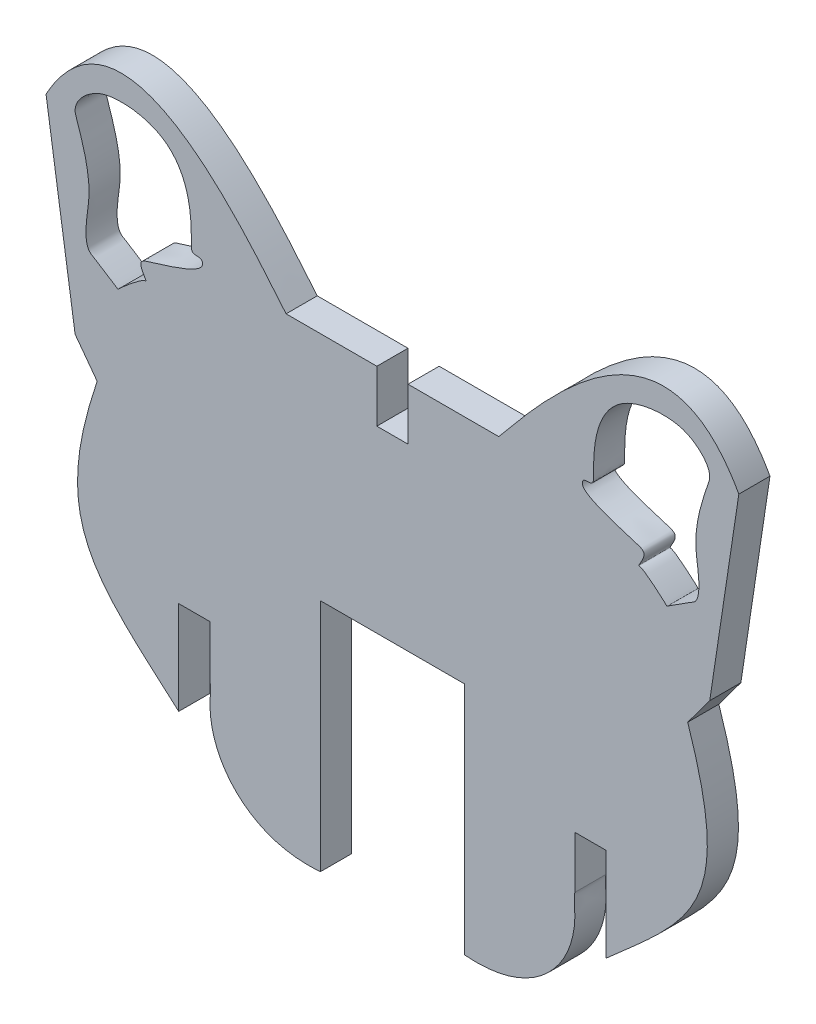
ISO-10303-21;
HEADER;
FILE_DESCRIPTION(('STEP AP214'),'2;1');
FILE_NAME('part.step','',(''),(''),'','','');
FILE_SCHEMA(('AUTOMOTIVE_DESIGN { 1 0 10303 214 1 1 1 1 }'));
ENDSEC;
DATA;
#1=APPLICATION_CONTEXT('core data for automotive mechanical design processes');
#2=APPLICATION_PROTOCOL_DEFINITION('international standard','automotive_design',2000,#1);
#3=PRODUCT_CONTEXT('',#1,'mechanical');
#4=PRODUCT('Part','Part','',(#3));
#5=PRODUCT_RELATED_PRODUCT_CATEGORY('part','',(#4));
#6=PRODUCT_DEFINITION_FORMATION('','',#4);
#7=PRODUCT_DEFINITION_CONTEXT('part definition',#1,'design');
#8=PRODUCT_DEFINITION('design','',#6,#7);
#9=PRODUCT_DEFINITION_SHAPE('','',#8);
#10=(LENGTH_UNIT() NAMED_UNIT(*) SI_UNIT(.MILLI.,.METRE.));
#11=(NAMED_UNIT(*) PLANE_ANGLE_UNIT() SI_UNIT($,.RADIAN.));
#12=(NAMED_UNIT(*) SI_UNIT($,.STERADIAN.) SOLID_ANGLE_UNIT());
#13=UNCERTAINTY_MEASURE_WITH_UNIT(LENGTH_MEASURE(1.E-05),#10,'distance_accuracy_value','');
#14=(GEOMETRIC_REPRESENTATION_CONTEXT(3) GLOBAL_UNCERTAINTY_ASSIGNED_CONTEXT((#13)) GLOBAL_UNIT_ASSIGNED_CONTEXT((#10,
#11,#12)) REPRESENTATION_CONTEXT('',''));
#15=CARTESIAN_POINT('',(0.,0.,0.));
#16=DIRECTION('',(0.,0.,1.));
#17=DIRECTION('',(1.,0.,0.));
#18=AXIS2_PLACEMENT_3D('',#15,#16,#17);
#19=CARTESIAN_POINT('',(10.2407732834807,22.2758124596455,3.));
#20=CARTESIAN_POINT('',(15.1352838805121,28.2082067401011,3.));
#21=CARTESIAN_POINT('',(26.2070604411327,42.0098659417211,3.));
#22=CARTESIAN_POINT('',(33.3623556721946,29.0385877180808,3.));
#23=B_SPLINE_CURVE_WITH_KNOTS('',3,(#19,#20,#21,#22),.UNSPECIFIED.,.F.,.F.,(4,4),(0.,1.),.UNSPECIFIED.);
#24=DIRECTION('',(0.,0.,-1.));
#25=VECTOR('',#24,1.);
#26=SURFACE_OF_LINEAR_EXTRUSION('',#23,#25);
#27=CARTESIAN_POINT('',(10.2407732834807,22.2758124596455,0.));
#28=CARTESIAN_POINT('',(15.1352838805121,28.2082067401011,0.));
#29=CARTESIAN_POINT('',(26.2070604411327,42.0098659417211,0.));
#30=CARTESIAN_POINT('',(33.3623556721946,29.0385877180808,0.));
#31=B_SPLINE_CURVE_WITH_KNOTS('',3,(#27,#28,#29,#30),.UNSPECIFIED.,.F.,.F.,(4,4),(0.,1.),.UNSPECIFIED.);
#32=CARTESIAN_POINT('',(10.2407732834807,22.2758124596455,0.));
#33=VERTEX_POINT('',#32);
#34=CARTESIAN_POINT('',(33.3623556721946,29.0385877180808,0.));
#35=VERTEX_POINT('',#34);
#36=EDGE_CURVE('E360',#33,#35,#31,.T.);
#37=ORIENTED_EDGE('',*,*,#36,.F.);
#38=DIRECTION('',(0.,0.,-1.));
#39=VECTOR('',#38,1.);
#40=CARTESIAN_POINT('',(10.2407732834807,22.2758124596455,3.));
#41=LINE('',#40,#39);
#42=CARTESIAN_POINT('',(10.2407732834807,22.2758124596455,3.));
#43=VERTEX_POINT('',#42);
#44=EDGE_CURVE('E11',#43,#33,#41,.T.);
#45=ORIENTED_EDGE('',*,*,#44,.F.);
#46=CARTESIAN_POINT('',(33.3623556721946,29.0385877180808,3.));
#47=VERTEX_POINT('',#46);
#48=EDGE_CURVE('E460',#43,#47,#23,.T.);
#49=ORIENTED_EDGE('',*,*,#48,.T.);
#50=DIRECTION('',(0.,0.,-1.));
#51=VECTOR('',#50,1.);
#52=CARTESIAN_POINT('',(33.3623556721946,29.0385877180808,3.));
#53=LINE('',#52,#51);
#54=EDGE_CURVE('E53',#47,#35,#53,.T.);
#55=ORIENTED_EDGE('',*,*,#54,.T.);
#56=EDGE_LOOP('',(#37,#45,#49,#55));
#57=FACE_BOUND('',#56,.T.);
#58=ADVANCED_FACE('F35',(#57),#26,.T.);
#59=CARTESIAN_POINT('',(0.,22.2758124596455,3.));
#60=DIRECTION('',(0.,1.,0.));
#61=DIRECTION('',(0.,0.,1.));
#62=AXIS2_PLACEMENT_3D('',#59,#60,#61);
#63=PLANE('',#62);
#64=DIRECTION('',(1.,0.,0.));
#65=VECTOR('',#64,1.);
#66=CARTESIAN_POINT('',(0.,22.2758124596455,0.));
#67=LINE('',#66,#65);
#68=CARTESIAN_POINT('',(1.5,22.2758124596455,0.));
#69=VERTEX_POINT('',#68);
#70=EDGE_CURVE('E357',#69,#33,#67,.T.);
#71=ORIENTED_EDGE('',*,*,#70,.F.);
#72=DIRECTION('',(0.,0.,-1.));
#73=VECTOR('',#72,1.);
#74=CARTESIAN_POINT('',(1.5,22.2758124596455,3.));
#75=LINE('',#74,#73);
#76=CARTESIAN_POINT('',(1.5,22.2758124596455,3.));
#77=VERTEX_POINT('',#76);
#78=EDGE_CURVE('E45',#77,#69,#75,.T.);
#79=ORIENTED_EDGE('',*,*,#78,.F.);
#80=DIRECTION('',(1.,0.,0.));
#81=VECTOR('',#80,1.);
#82=CARTESIAN_POINT('',(0.,22.2758124596455,3.));
#83=LINE('',#82,#81);
#84=EDGE_CURVE('E463',#77,#43,#83,.T.);
#85=ORIENTED_EDGE('',*,*,#84,.T.);
#86=ORIENTED_EDGE('',*,*,#44,.T.);
#87=EDGE_LOOP('',(#71,#79,#85,#86));
#88=FACE_BOUND('',#87,.T.);
#89=ADVANCED_FACE('F358',(#88),#63,.T.);
#90=CARTESIAN_POINT('',(1.5,0.,3.));
#91=DIRECTION('',(-1.,0.,0.));
#92=DIRECTION('',(0.,0.,1.));
#93=AXIS2_PLACEMENT_3D('',#90,#91,#92);
#94=PLANE('',#93);
#95=DIRECTION('',(0.,1.,0.));
#96=VECTOR('',#95,1.);
#97=CARTESIAN_POINT('',(1.5,0.,0.));
#98=LINE('',#97,#96);
#99=CARTESIAN_POINT('',(1.5,17.2758124596455,0.));
#100=VERTEX_POINT('',#99);
#101=EDGE_CURVE('E350',#100,#69,#98,.T.);
#102=ORIENTED_EDGE('',*,*,#101,.F.);
#103=DIRECTION('',(0.,0.,-1.));
#104=VECTOR('',#103,1.);
#105=CARTESIAN_POINT('',(1.5,17.2758124596455,3.));
#106=LINE('',#105,#104);
#107=CARTESIAN_POINT('',(1.5,17.2758124596455,3.));
#108=VERTEX_POINT('',#107);
#109=EDGE_CURVE('E343',#108,#100,#106,.T.);
#110=ORIENTED_EDGE('',*,*,#109,.F.);
#111=DIRECTION('',(0.,1.,0.));
#112=VECTOR('',#111,1.);
#113=CARTESIAN_POINT('',(1.5,0.,3.));
#114=LINE('',#113,#112);
#115=EDGE_CURVE('E352',#108,#77,#114,.T.);
#116=ORIENTED_EDGE('',*,*,#115,.T.);
#117=ORIENTED_EDGE('',*,*,#78,.T.);
#118=EDGE_LOOP('',(#102,#110,#116,#117));
#119=FACE_BOUND('',#118,.T.);
#120=ADVANCED_FACE('F348',(#119),#94,.T.);
#121=CARTESIAN_POINT('',(0.,17.2758124596455,3.));
#122=DIRECTION('',(0.,-1.,0.));
#123=DIRECTION('',(0.,0.,-1.));
#124=AXIS2_PLACEMENT_3D('',#121,#122,#123);
#125=PLANE('',#124);
#126=DIRECTION('',(-1.,0.,0.));
#127=VECTOR('',#126,1.);
#128=CARTESIAN_POINT('',(0.,17.2758124596455,0.));
#129=LINE('',#128,#127);
#130=CARTESIAN_POINT('',(-1.5,17.2758124596455,0.));
#131=VERTEX_POINT('',#130);
#132=EDGE_CURVE('E365',#100,#131,#129,.T.);
#133=ORIENTED_EDGE('',*,*,#132,.T.);
#134=DIRECTION('',(0.,0.,-1.));
#135=VECTOR('',#134,1.);
#136=CARTESIAN_POINT('',(-1.5,17.2758124596455,3.));
#137=LINE('',#136,#135);
#138=CARTESIAN_POINT('',(-1.5,17.2758124596455,3.));
#139=VERTEX_POINT('',#138);
#140=EDGE_CURVE('E340',#139,#131,#137,.T.);
#141=ORIENTED_EDGE('',*,*,#140,.F.);
#142=DIRECTION('',(-1.,0.,0.));
#143=VECTOR('',#142,1.);
#144=CARTESIAN_POINT('',(0.,17.2758124596455,3.));
#145=LINE('',#144,#143);
#146=EDGE_CURVE('E559',#108,#139,#145,.T.);
#147=ORIENTED_EDGE('',*,*,#146,.F.);
#148=ORIENTED_EDGE('',*,*,#109,.T.);
#149=EDGE_LOOP('',(#133,#141,#147,#148));
#150=FACE_BOUND('',#149,.T.);
#151=ADVANCED_FACE('F485',(#150),#125,.F.);
#152=CARTESIAN_POINT('',(-1.5,0.,3.));
#153=DIRECTION('',(-1.,0.,0.));
#154=DIRECTION('',(0.,0.,1.));
#155=AXIS2_PLACEMENT_3D('',#152,#153,#154);
#156=PLANE('',#155);
#157=DIRECTION('',(0.,1.,0.));
#158=VECTOR('',#157,1.);
#159=CARTESIAN_POINT('',(-1.5,0.,0.));
#160=LINE('',#159,#158);
#161=CARTESIAN_POINT('',(-1.5,22.2758124596455,0.));
#162=VERTEX_POINT('',#161);
#163=EDGE_CURVE('E367',#131,#162,#160,.T.);
#164=ORIENTED_EDGE('',*,*,#163,.T.);
#165=DIRECTION('',(0.,0.,-1.));
#166=VECTOR('',#165,1.);
#167=CARTESIAN_POINT('',(-1.5,22.2758124596455,3.));
#168=LINE('',#167,#166);
#169=CARTESIAN_POINT('',(-1.5,22.2758124596455,3.));
#170=VERTEX_POINT('',#169);
#171=EDGE_CURVE('E337',#170,#162,#168,.T.);
#172=ORIENTED_EDGE('',*,*,#171,.F.);
#173=DIRECTION('',(0.,1.,0.));
#174=VECTOR('',#173,1.);
#175=CARTESIAN_POINT('',(-1.5,0.,3.));
#176=LINE('',#175,#174);
#177=EDGE_CURVE('E556',#139,#170,#176,.T.);
#178=ORIENTED_EDGE('',*,*,#177,.F.);
#179=ORIENTED_EDGE('',*,*,#140,.T.);
#180=EDGE_LOOP('',(#164,#172,#178,#179));
#181=FACE_BOUND('',#180,.T.);
#182=ADVANCED_FACE('F488',(#181),#156,.F.);
#183=CARTESIAN_POINT('',(0.,22.2758124596455,3.));
#184=DIRECTION('',(0.,-1.,0.));
#185=DIRECTION('',(0.,0.,-1.));
#186=AXIS2_PLACEMENT_3D('',#183,#184,#185);
#187=PLANE('',#186);
#188=DIRECTION('',(-1.,0.,0.));
#189=VECTOR('',#188,1.);
#190=CARTESIAN_POINT('',(0.,22.2758124596455,0.));
#191=LINE('',#190,#189);
#192=CARTESIAN_POINT('',(-10.2407732834807,22.2758124596455,0.));
#193=VERTEX_POINT('',#192);
#194=EDGE_CURVE('E372',#162,#193,#191,.T.);
#195=ORIENTED_EDGE('',*,*,#194,.T.);
#196=DIRECTION('',(0.,0.,-1.));
#197=VECTOR('',#196,1.);
#198=CARTESIAN_POINT('',(-10.2407732834807,22.2758124596455,3.));
#199=LINE('',#198,#197);
#200=CARTESIAN_POINT('',(-10.2407732834807,22.2758124596455,3.));
#201=VERTEX_POINT('',#200);
#202=EDGE_CURVE('E334',#201,#193,#199,.T.);
#203=ORIENTED_EDGE('',*,*,#202,.F.);
#204=DIRECTION('',(-1.,0.,0.));
#205=VECTOR('',#204,1.);
#206=CARTESIAN_POINT('',(0.,22.2758124596455,3.));
#207=LINE('',#206,#205);
#208=EDGE_CURVE('E512',#170,#201,#207,.T.);
#209=ORIENTED_EDGE('',*,*,#208,.F.);
#210=ORIENTED_EDGE('',*,*,#171,.T.);
#211=EDGE_LOOP('',(#195,#203,#209,#210));
#212=FACE_BOUND('',#211,.T.);
#213=ADVANCED_FACE('F492',(#212),#187,.F.);
#214=CARTESIAN_POINT('',(-10.2407732834807,22.2758124596455,3.));
#215=CARTESIAN_POINT('',(-15.1352838805121,28.2082067401011,3.));
#216=CARTESIAN_POINT('',(-26.2070604411327,42.0098659417211,3.));
#217=CARTESIAN_POINT('',(-33.3623556721946,29.0385877180808,3.));
#218=B_SPLINE_CURVE_WITH_KNOTS('',3,(#214,#215,#216,#217),.UNSPECIFIED.,.F.,.F.,(4,4),(0.,1.),.UNSPECIFIED.);
#219=DIRECTION('',(0.,0.,-1.));
#220=VECTOR('',#219,1.);
#221=SURFACE_OF_LINEAR_EXTRUSION('',#218,#220);
#222=CARTESIAN_POINT('',(-10.2407732834807,22.2758124596455,0.));
#223=CARTESIAN_POINT('',(-15.1352838805121,28.2082067401011,0.));
#224=CARTESIAN_POINT('',(-26.2070604411327,42.0098659417211,0.));
#225=CARTESIAN_POINT('',(-33.3623556721946,29.0385877180808,0.));
#226=B_SPLINE_CURVE_WITH_KNOTS('',3,(#222,#223,#224,#225),.UNSPECIFIED.,.F.,.F.,(4,4),(0.,1.),.UNSPECIFIED.);
#227=CARTESIAN_POINT('',(-33.3623556721946,29.0385877180808,0.));
#228=VERTEX_POINT('',#227);
#229=EDGE_CURVE('E375',#193,#228,#226,.T.);
#230=ORIENTED_EDGE('',*,*,#229,.T.);
#231=DIRECTION('',(0.,0.,-1.));
#232=VECTOR('',#231,1.);
#233=CARTESIAN_POINT('',(-33.3623556721946,29.0385877180808,3.));
#234=LINE('',#233,#232);
#235=CARTESIAN_POINT('',(-33.3623556721946,29.0385877180808,3.));
#236=VERTEX_POINT('',#235);
#237=EDGE_CURVE('E331',#236,#228,#234,.T.);
#238=ORIENTED_EDGE('',*,*,#237,.F.);
#239=EDGE_CURVE('E504',#201,#236,#218,.T.);
#240=ORIENTED_EDGE('',*,*,#239,.F.);
#241=ORIENTED_EDGE('',*,*,#202,.T.);
#242=EDGE_LOOP('',(#230,#238,#240,#241));
#243=FACE_BOUND('',#242,.T.);
#244=ADVANCED_FACE('F496',(#243),#221,.F.);
#245=CARTESIAN_POINT('',(-28.3546378058958,-4.26372827527502,3.));
#246=DIRECTION('',(0.988882400585958,0.148699690017676,0.));
#247=DIRECTION('',(-0.148699690017676,0.988882400585958,0.));
#248=AXIS2_PLACEMENT_3D('',#245,#246,#247);
#249=PLANE('',#248);
#250=DIRECTION('',(0.148699690017676,-0.988882400585958,0.));
#251=VECTOR('',#250,1.);
#252=CARTESIAN_POINT('',(-28.3546378058958,-4.26372827527502,0.));
#253=LINE('',#252,#251);
#254=CARTESIAN_POINT('',(-30.5611824366832,10.4102307036154,0.));
#255=VERTEX_POINT('',#254);
#256=EDGE_CURVE('E380',#228,#255,#253,.T.);
#257=ORIENTED_EDGE('',*,*,#256,.T.);
#258=DIRECTION('',(0.,0.,-1.));
#259=VECTOR('',#258,1.);
#260=CARTESIAN_POINT('',(-30.5611824366832,10.4102307036154,3.));
#261=LINE('',#260,#259);
#262=CARTESIAN_POINT('',(-30.5611824366832,10.4102307036154,3.));
#263=VERTEX_POINT('',#262);
#264=EDGE_CURVE('E328',#263,#255,#261,.T.);
#265=ORIENTED_EDGE('',*,*,#264,.F.);
#266=DIRECTION('',(0.148699690017676,-0.988882400585958,0.));
#267=VECTOR('',#266,1.);
#268=CARTESIAN_POINT('',(-28.3546378058958,-4.26372827527502,3.));
#269=LINE('',#268,#267);
#270=EDGE_CURVE('E511',#236,#263,#269,.T.);
#271=ORIENTED_EDGE('',*,*,#270,.F.);
#272=ORIENTED_EDGE('',*,*,#237,.T.);
#273=EDGE_LOOP('',(#257,#265,#271,#272));
#274=FACE_BOUND('',#273,.T.);
#275=ADVANCED_FACE('F501',(#274),#249,.F.);
#276=CARTESIAN_POINT('',(-14.7102254311662,-10.9275960345806,3.));
#277=DIRECTION('',(0.802743847954452,0.596324001337594,0.));
#278=DIRECTION('',(-0.596324001337595,0.802743847954452,0.));
#279=AXIS2_PLACEMENT_3D('',#276,#277,#278);
#280=PLANE('',#279);
#281=DIRECTION('',(0.596324001337595,-0.802743847954452,0.));
#282=VECTOR('',#281,1.);
#283=CARTESIAN_POINT('',(-14.7102254311662,-10.9275960345806,0.));
#284=LINE('',#283,#282);
#285=CARTESIAN_POINT('',(-28.4383445395592,7.55256430364083,0.));
#286=VERTEX_POINT('',#285);
#287=EDGE_CURVE('E386',#255,#286,#284,.T.);
#288=ORIENTED_EDGE('',*,*,#287,.T.);
#289=DIRECTION('',(0.,0.,-1.));
#290=VECTOR('',#289,1.);
#291=CARTESIAN_POINT('',(-28.4383445395592,7.55256430364083,3.));
#292=LINE('',#291,#290);
#293=CARTESIAN_POINT('',(-28.4383445395592,7.55256430364083,3.));
#294=VERTEX_POINT('',#293);
#295=EDGE_CURVE('E325',#294,#286,#292,.T.);
#296=ORIENTED_EDGE('',*,*,#295,.F.);
#297=DIRECTION('',(0.596324001337595,-0.802743847954452,0.));
#298=VECTOR('',#297,1.);
#299=CARTESIAN_POINT('',(-14.7102254311662,-10.9275960345806,3.));
#300=LINE('',#299,#298);
#301=EDGE_CURVE('E519',#263,#294,#300,.T.);
#302=ORIENTED_EDGE('',*,*,#301,.F.);
#303=ORIENTED_EDGE('',*,*,#264,.T.);
#304=EDGE_LOOP('',(#288,#296,#302,#303));
#305=FACE_BOUND('',#304,.T.);
#306=ADVANCED_FACE('F538',(#305),#280,.F.);
#307=CARTESIAN_POINT('',(-28.4383445395592,7.55256430364083,3.));
#308=CARTESIAN_POINT('',(-32.9976327768061,-6.01858174026014,3.));
#309=CARTESIAN_POINT('',(-28.8808972115854,-8.73666562107748,3.));
#310=CARTESIAN_POINT('',(-20.583,-16.059,3.));
#311=B_SPLINE_CURVE_WITH_KNOTS('',3,(#307,#308,#309,#310),.UNSPECIFIED.,.F.,.F.,(4,4),(0.,1.),.UNSPECIFIED.);
#312=DIRECTION('',(0.,0.,-1.));
#313=VECTOR('',#312,1.);
#314=SURFACE_OF_LINEAR_EXTRUSION('',#311,#313);
#315=CARTESIAN_POINT('',(-28.4383445395592,7.55256430364083,0.));
#316=CARTESIAN_POINT('',(-32.9976327768061,-6.01858174026014,0.));
#317=CARTESIAN_POINT('',(-28.8808972115854,-8.73666562107748,0.));
#318=CARTESIAN_POINT('',(-20.583,-16.059,0.));
#319=B_SPLINE_CURVE_WITH_KNOTS('',3,(#315,#316,#317,#318),.UNSPECIFIED.,.F.,.F.,(4,4),(0.,1.),.UNSPECIFIED.);
#320=CARTESIAN_POINT('',(-20.583,-16.059,0.));
#321=VERTEX_POINT('',#320);
#322=EDGE_CURVE('E389',#286,#321,#319,.T.);
#323=ORIENTED_EDGE('',*,*,#322,.T.);
#324=DIRECTION('',(0.,0.,-1.));
#325=VECTOR('',#324,1.);
#326=CARTESIAN_POINT('',(-20.583,-16.059,3.));
#327=LINE('',#326,#325);
#328=CARTESIAN_POINT('',(-20.583,-16.059,3.));
#329=VERTEX_POINT('',#328);
#330=EDGE_CURVE('E322',#329,#321,#327,.T.);
#331=ORIENTED_EDGE('',*,*,#330,.F.);
#332=EDGE_CURVE('E522',#294,#329,#311,.T.);
#333=ORIENTED_EDGE('',*,*,#332,.F.);
#334=ORIENTED_EDGE('',*,*,#295,.T.);
#335=EDGE_LOOP('',(#323,#331,#333,#334));
#336=FACE_BOUND('',#335,.T.);
#337=ADVANCED_FACE('F534',(#336),#314,.F.);
#338=CARTESIAN_POINT('',(-20.583,0.,3.));
#339=DIRECTION('',(-1.,0.,0.));
#340=DIRECTION('',(0.,0.,1.));
#341=AXIS2_PLACEMENT_3D('',#338,#339,#340);
#342=PLANE('',#341);
#343=DIRECTION('',(0.,1.,0.));
#344=VECTOR('',#343,1.);
#345=CARTESIAN_POINT('',(-20.583,0.,0.));
#346=LINE('',#345,#344);
#347=CARTESIAN_POINT('',(-20.583,-7.064,0.));
#348=VERTEX_POINT('',#347);
#349=EDGE_CURVE('E394',#321,#348,#346,.T.);
#350=ORIENTED_EDGE('',*,*,#349,.T.);
#351=DIRECTION('',(0.,0.,-1.));
#352=VECTOR('',#351,1.);
#353=CARTESIAN_POINT('',(-20.583,-7.064,3.));
#354=LINE('',#353,#352);
#355=CARTESIAN_POINT('',(-20.583,-7.064,3.));
#356=VERTEX_POINT('',#355);
#357=EDGE_CURVE('E320',#356,#348,#354,.T.);
#358=ORIENTED_EDGE('',*,*,#357,.F.);
#359=DIRECTION('',(0.,1.,0.));
#360=VECTOR('',#359,1.);
#361=CARTESIAN_POINT('',(-20.583,0.,3.));
#362=LINE('',#361,#360);
#363=EDGE_CURVE('E528',#329,#356,#362,.T.);
#364=ORIENTED_EDGE('',*,*,#363,.F.);
#365=ORIENTED_EDGE('',*,*,#330,.T.);
#366=EDGE_LOOP('',(#350,#358,#364,#365));
#367=FACE_BOUND('',#366,.T.);
#368=ADVANCED_FACE('F537',(#367),#342,.F.);
#369=CARTESIAN_POINT('',(0.,-7.064,3.));
#370=DIRECTION('',(0.,-1.,0.));
#371=DIRECTION('',(1.,0.,0.));
#372=AXIS2_PLACEMENT_3D('',#369,#370,#371);
#373=PLANE('',#372);
#374=DIRECTION('',(-1.,0.,0.));
#375=VECTOR('',#374,1.);
#376=CARTESIAN_POINT('',(0.,-7.064,0.));
#377=LINE('',#376,#375);
#378=CARTESIAN_POINT('',(-17.583,-7.064,0.));
#379=VERTEX_POINT('',#378);
#380=EDGE_CURVE('E400',#379,#348,#377,.T.);
#381=ORIENTED_EDGE('',*,*,#380,.F.);
#382=DIRECTION('',(0.,0.,-1.));
#383=VECTOR('',#382,1.);
#384=CARTESIAN_POINT('',(-17.583,-7.064,3.));
#385=LINE('',#384,#383);
#386=CARTESIAN_POINT('',(-17.583,-7.064,3.));
#387=VERTEX_POINT('',#386);
#388=EDGE_CURVE('E318',#387,#379,#385,.T.);
#389=ORIENTED_EDGE('',*,*,#388,.F.);
#390=DIRECTION('',(-1.,0.,0.));
#391=VECTOR('',#390,1.);
#392=CARTESIAN_POINT('',(0.,-7.064,3.));
#393=LINE('',#392,#391);
#394=EDGE_CURVE('E772',#387,#356,#393,.T.);
#395=ORIENTED_EDGE('',*,*,#394,.T.);
#396=ORIENTED_EDGE('',*,*,#357,.T.);
#397=EDGE_LOOP('',(#381,#389,#395,#396));
#398=FACE_BOUND('',#397,.T.);
#399=ADVANCED_FACE('F684',(#398),#373,.T.);
#400=CARTESIAN_POINT('',(-17.583,0.,3.));
#401=DIRECTION('',(-1.,0.,0.));
#402=DIRECTION('',(0.,-1.,0.));
#403=AXIS2_PLACEMENT_3D('',#400,#401,#402);
#404=PLANE('',#403);
#405=DIRECTION('',(0.,1.,0.));
#406=VECTOR('',#405,1.);
#407=CARTESIAN_POINT('',(-17.583,0.,0.));
#408=LINE('',#407,#406);
#409=CARTESIAN_POINT('',(-17.583,-12.059,0.));
#410=VERTEX_POINT('',#409);
#411=EDGE_CURVE('E403',#410,#379,#408,.T.);
#412=ORIENTED_EDGE('',*,*,#411,.F.);
#413=DIRECTION('',(0.,0.,-1.));
#414=VECTOR('',#413,1.);
#415=CARTESIAN_POINT('',(-17.583,-12.059,3.));
#416=LINE('',#415,#414);
#417=CARTESIAN_POINT('',(-17.583,-12.059,3.));
#418=VERTEX_POINT('',#417);
#419=EDGE_CURVE('E316',#418,#410,#416,.T.);
#420=ORIENTED_EDGE('',*,*,#419,.F.);
#421=DIRECTION('',(0.,1.,0.));
#422=VECTOR('',#421,1.);
#423=CARTESIAN_POINT('',(-17.583,0.,3.));
#424=LINE('',#423,#422);
#425=EDGE_CURVE('E775',#418,#387,#424,.T.);
#426=ORIENTED_EDGE('',*,*,#425,.T.);
#427=ORIENTED_EDGE('',*,*,#388,.T.);
#428=EDGE_LOOP('',(#412,#420,#426,#427));
#429=FACE_BOUND('',#428,.T.);
#430=ADVANCED_FACE('F674',(#429),#404,.T.);
#431=CARTESIAN_POINT('',(-20.583,-12.059,3.));
#432=CARTESIAN_POINT('',(-20.555839729085,-12.047378816658,3.));
#433=CARTESIAN_POINT('',(-17.1789986947145,-10.7860209640902,3.));
#434=CARTESIAN_POINT('',(-18.391170135111,-17.9068204073568,3.));
#435=CARTESIAN_POINT('',(-13.6514725911881,-23.218102231731,3.));
#436=CARTESIAN_POINT('',(-6.92349999999999,-22.594,3.));
#437=B_SPLINE_CURVE_WITH_KNOTS('',3,(#431,#432,#433,#434,#435,#436),.UNSPECIFIED.,.F.,.F.,(4,1,
1,4),(0.,0.188319212461199,0.288319212461199,1.),.UNSPECIFIED.);
#438=DIRECTION('',(0.,0.,-1.));
#439=VECTOR('',#438,1.);
#440=SURFACE_OF_LINEAR_EXTRUSION('',#437,#439);
#441=CARTESIAN_POINT('',(-20.583,-12.059,0.));
#442=CARTESIAN_POINT('',(-20.555839729085,-12.047378816658,0.));
#443=CARTESIAN_POINT('',(-17.1789986947145,-10.7860209640902,0.));
#444=CARTESIAN_POINT('',(-18.391170135111,-17.9068204073568,0.));
#445=CARTESIAN_POINT('',(-13.6514725911881,-23.218102231731,0.));
#446=CARTESIAN_POINT('',(-6.92349999999999,-22.594,0.));
#447=B_SPLINE_CURVE_WITH_KNOTS('',3,(#441,#442,#443,#444,#445,#446),.UNSPECIFIED.,.F.,.F.,(4,1,
1,4),(0.,0.188319212461199,0.288319212461199,1.),.UNSPECIFIED.);
#448=CARTESIAN_POINT('',(-6.9235,-22.594,0.));
#449=VERTEX_POINT('',#448);
#450=EDGE_CURVE('E406',#410,#449,#447,.T.);
#451=ORIENTED_EDGE('',*,*,#450,.T.);
#452=DIRECTION('',(0.,0.,-1.));
#453=VECTOR('',#452,1.);
#454=CARTESIAN_POINT('',(-6.9235,-22.594,3.));
#455=LINE('',#454,#453);
#456=CARTESIAN_POINT('',(-6.9235,-22.594,3.));
#457=VERTEX_POINT('',#456);
#458=EDGE_CURVE('E314',#457,#449,#455,.T.);
#459=ORIENTED_EDGE('',*,*,#458,.F.);
#460=EDGE_CURVE('E776',#418,#457,#437,.T.);
#461=ORIENTED_EDGE('',*,*,#460,.F.);
#462=ORIENTED_EDGE('',*,*,#419,.T.);
#463=EDGE_LOOP('',(#451,#459,#461,#462));
#464=FACE_BOUND('',#463,.T.);
#465=ADVANCED_FACE('F664',(#464),#440,.F.);
#466=CARTESIAN_POINT('',(-6.9235,0.,3.));
#467=DIRECTION('',(1.,0.,0.));
#468=DIRECTION('',(0.,1.,0.));
#469=AXIS2_PLACEMENT_3D('',#466,#467,#468);
#470=PLANE('',#469);
#471=DIRECTION('',(0.,-1.,0.));
#472=VECTOR('',#471,1.);
#473=CARTESIAN_POINT('',(-6.9235,0.,0.));
#474=LINE('',#473,#472);
#475=CARTESIAN_POINT('',(-6.9235,0.,0.));
#476=VERTEX_POINT('',#475);
#477=EDGE_CURVE('E411',#476,#449,#474,.T.);
#478=ORIENTED_EDGE('',*,*,#477,.F.);
#479=DIRECTION('',(0.,0.,-1.));
#480=VECTOR('',#479,1.);
#481=CARTESIAN_POINT('',(-6.9235,0.,3.));
#482=LINE('',#481,#480);
#483=CARTESIAN_POINT('',(-6.9235,0.,3.));
#484=VERTEX_POINT('',#483);
#485=EDGE_CURVE('E312',#484,#476,#482,.T.);
#486=ORIENTED_EDGE('',*,*,#485,.F.);
#487=DIRECTION('',(0.,-1.,0.));
#488=VECTOR('',#487,1.);
#489=CARTESIAN_POINT('',(-6.9235,0.,3.));
#490=LINE('',#489,#488);
#491=EDGE_CURVE('E783',#484,#457,#490,.T.);
#492=ORIENTED_EDGE('',*,*,#491,.T.);
#493=ORIENTED_EDGE('',*,*,#458,.T.);
#494=EDGE_LOOP('',(#478,#486,#492,#493));
#495=FACE_BOUND('',#494,.T.);
#496=ADVANCED_FACE('F655',(#495),#470,.T.);
#497=CARTESIAN_POINT('',(0.,0.,3.));
#498=DIRECTION('',(0.,1.,0.));
#499=DIRECTION('',(0.,0.,1.));
#500=AXIS2_PLACEMENT_3D('',#497,#498,#499);
#501=PLANE('',#500);
#502=DIRECTION('',(1.,0.,0.));
#503=VECTOR('',#502,1.);
#504=CARTESIAN_POINT('',(0.,0.,0.));
#505=LINE('',#504,#503);
#506=CARTESIAN_POINT('',(6.9235,0.,0.));
#507=VERTEX_POINT('',#506);
#508=EDGE_CURVE('E417',#476,#507,#505,.T.);
#509=ORIENTED_EDGE('',*,*,#508,.T.);
#510=DIRECTION('',(0.,0.,-1.));
#511=VECTOR('',#510,1.);
#512=CARTESIAN_POINT('',(6.9235,0.,3.));
#513=LINE('',#512,#511);
#514=CARTESIAN_POINT('',(6.9235,0.,3.));
#515=VERTEX_POINT('',#514);
#516=EDGE_CURVE('E309',#515,#507,#513,.T.);
#517=ORIENTED_EDGE('',*,*,#516,.F.);
#518=DIRECTION('',(1.,0.,0.));
#519=VECTOR('',#518,1.);
#520=CARTESIAN_POINT('',(0.,0.,3.));
#521=LINE('',#520,#519);
#522=EDGE_CURVE('E788',#484,#515,#521,.T.);
#523=ORIENTED_EDGE('',*,*,#522,.F.);
#524=ORIENTED_EDGE('',*,*,#485,.T.);
#525=EDGE_LOOP('',(#509,#517,#523,#524));
#526=FACE_BOUND('',#525,.T.);
#527=ADVANCED_FACE('F646',(#526),#501,.F.);
#528=CARTESIAN_POINT('',(6.9235,0.,3.));
#529=DIRECTION('',(1.,0.,0.));
#530=DIRECTION('',(0.,1.,0.));
#531=AXIS2_PLACEMENT_3D('',#528,#529,#530);
#532=PLANE('',#531);
#533=DIRECTION('',(0.,-1.,0.));
#534=VECTOR('',#533,1.);
#535=CARTESIAN_POINT('',(6.9235,0.,0.));
#536=LINE('',#535,#534);
#537=CARTESIAN_POINT('',(6.9235,-22.594,0.));
#538=VERTEX_POINT('',#537);
#539=EDGE_CURVE('E420',#507,#538,#536,.T.);
#540=ORIENTED_EDGE('',*,*,#539,.T.);
#541=DIRECTION('',(0.,0.,-1.));
#542=VECTOR('',#541,1.);
#543=CARTESIAN_POINT('',(6.9235,-22.594,3.));
#544=LINE('',#543,#542);
#545=CARTESIAN_POINT('',(6.9235,-22.594,3.));
#546=VERTEX_POINT('',#545);
#547=EDGE_CURVE('E307',#546,#538,#544,.T.);
#548=ORIENTED_EDGE('',*,*,#547,.F.);
#549=DIRECTION('',(0.,-1.,0.));
#550=VECTOR('',#549,1.);
#551=CARTESIAN_POINT('',(6.9235,0.,3.));
#552=LINE('',#551,#550);
#553=EDGE_CURVE('E284',#515,#546,#552,.T.);
#554=ORIENTED_EDGE('',*,*,#553,.F.);
#555=ORIENTED_EDGE('',*,*,#516,.T.);
#556=EDGE_LOOP('',(#540,#548,#554,#555));
#557=FACE_BOUND('',#556,.T.);
#558=ADVANCED_FACE('F273',(#557),#532,.F.);
#559=CARTESIAN_POINT('',(20.583,-12.059,3.));
#560=CARTESIAN_POINT('',(20.555839729085,-12.047378816658,3.));
#561=CARTESIAN_POINT('',(17.1789986947145,-10.7860209640902,3.));
#562=CARTESIAN_POINT('',(18.391170135111,-17.9068204073568,3.));
#563=CARTESIAN_POINT('',(13.6514725911881,-23.218102231731,3.));
#564=CARTESIAN_POINT('',(6.92349999999999,-22.594,3.));
#565=B_SPLINE_CURVE_WITH_KNOTS('',3,(#559,#560,#561,#562,#563,#564),.UNSPECIFIED.,.F.,.F.,(4,1,
1,4),(0.,0.188319212461199,0.288319212461199,1.),.UNSPECIFIED.);
#566=DIRECTION('',(0.,0.,-1.));
#567=VECTOR('',#566,1.);
#568=SURFACE_OF_LINEAR_EXTRUSION('',#565,#567);
#569=CARTESIAN_POINT('',(20.583,-12.059,0.));
#570=CARTESIAN_POINT('',(20.555839729085,-12.047378816658,0.));
#571=CARTESIAN_POINT('',(17.1789986947145,-10.7860209640902,0.));
#572=CARTESIAN_POINT('',(18.391170135111,-17.9068204073568,0.));
#573=CARTESIAN_POINT('',(13.6514725911881,-23.218102231731,0.));
#574=CARTESIAN_POINT('',(6.92349999999999,-22.594,0.));
#575=B_SPLINE_CURVE_WITH_KNOTS('',3,(#569,#570,#571,#572,#573,#574),.UNSPECIFIED.,.F.,.F.,(4,1,
1,4),(0.,0.188319212461199,0.288319212461199,1.),.UNSPECIFIED.);
#576=CARTESIAN_POINT('',(17.583,-12.059,0.));
#577=VERTEX_POINT('',#576);
#578=EDGE_CURVE('E423',#577,#538,#575,.T.);
#579=ORIENTED_EDGE('',*,*,#578,.F.);
#580=DIRECTION('',(0.,0.,-1.));
#581=VECTOR('',#580,1.);
#582=CARTESIAN_POINT('',(17.583,-12.059,3.));
#583=LINE('',#582,#581);
#584=CARTESIAN_POINT('',(17.583,-12.059,3.));
#585=VERTEX_POINT('',#584);
#586=EDGE_CURVE('E305',#585,#577,#583,.T.);
#587=ORIENTED_EDGE('',*,*,#586,.F.);
#588=EDGE_CURVE('E276',#585,#546,#565,.T.);
#589=ORIENTED_EDGE('',*,*,#588,.T.);
#590=ORIENTED_EDGE('',*,*,#547,.T.);
#591=EDGE_LOOP('',(#579,#587,#589,#590));
#592=FACE_BOUND('',#591,.T.);
#593=ADVANCED_FACE('F268',(#592),#568,.T.);
#594=CARTESIAN_POINT('',(17.583,0.,3.));
#595=DIRECTION('',(-1.,0.,0.));
#596=DIRECTION('',(0.,-1.,0.));
#597=AXIS2_PLACEMENT_3D('',#594,#595,#596);
#598=PLANE('',#597);
#599=DIRECTION('',(0.,1.,0.));
#600=VECTOR('',#599,1.);
#601=CARTESIAN_POINT('',(17.583,0.,0.));
#602=LINE('',#601,#600);
#603=CARTESIAN_POINT('',(17.583,-7.064,0.));
#604=VERTEX_POINT('',#603);
#605=EDGE_CURVE('E428',#577,#604,#602,.T.);
#606=ORIENTED_EDGE('',*,*,#605,.T.);
#607=DIRECTION('',(0.,0.,-1.));
#608=VECTOR('',#607,1.);
#609=CARTESIAN_POINT('',(17.583,-7.064,3.));
#610=LINE('',#609,#608);
#611=CARTESIAN_POINT('',(17.583,-7.064,3.));
#612=VERTEX_POINT('',#611);
#613=EDGE_CURVE('E299',#612,#604,#610,.T.);
#614=ORIENTED_EDGE('',*,*,#613,.F.);
#615=DIRECTION('',(0.,1.,0.));
#616=VECTOR('',#615,1.);
#617=CARTESIAN_POINT('',(17.583,0.,3.));
#618=LINE('',#617,#616);
#619=EDGE_CURVE('E283',#585,#612,#618,.T.);
#620=ORIENTED_EDGE('',*,*,#619,.F.);
#621=ORIENTED_EDGE('',*,*,#586,.T.);
#622=EDGE_LOOP('',(#606,#614,#620,#621));
#623=FACE_BOUND('',#622,.T.);
#624=ADVANCED_FACE('F264',(#623),#598,.F.);
#625=CARTESIAN_POINT('',(0.,-7.064,3.));
#626=DIRECTION('',(0.,1.,0.));
#627=DIRECTION('',(-1.,0.,0.));
#628=AXIS2_PLACEMENT_3D('',#625,#626,#627);
#629=PLANE('',#628);
#630=DIRECTION('',(1.,0.,0.));
#631=VECTOR('',#630,1.);
#632=CARTESIAN_POINT('',(0.,-7.064,0.));
#633=LINE('',#632,#631);
#634=CARTESIAN_POINT('',(20.583,-7.064,0.));
#635=VERTEX_POINT('',#634);
#636=EDGE_CURVE('E434',#604,#635,#633,.T.);
#637=ORIENTED_EDGE('',*,*,#636,.T.);
#638=DIRECTION('',(0.,0.,-1.));
#639=VECTOR('',#638,1.);
#640=CARTESIAN_POINT('',(20.583,-7.064,3.));
#641=LINE('',#640,#639);
#642=CARTESIAN_POINT('',(20.583,-7.064,3.));
#643=VERTEX_POINT('',#642);
#644=EDGE_CURVE('E294',#643,#635,#641,.T.);
#645=ORIENTED_EDGE('',*,*,#644,.F.);
#646=DIRECTION('',(1.,0.,0.));
#647=VECTOR('',#646,1.);
#648=CARTESIAN_POINT('',(0.,-7.064,3.));
#649=LINE('',#648,#647);
#650=EDGE_CURVE('E291',#612,#643,#649,.T.);
#651=ORIENTED_EDGE('',*,*,#650,.F.);
#652=ORIENTED_EDGE('',*,*,#613,.T.);
#653=EDGE_LOOP('',(#637,#645,#651,#652));
#654=FACE_BOUND('',#653,.T.);
#655=ADVANCED_FACE('F260',(#654),#629,.F.);
#656=CARTESIAN_POINT('',(20.583,0.,3.));
#657=DIRECTION('',(-1.,0.,0.));
#658=DIRECTION('',(0.,-1.,0.));
#659=AXIS2_PLACEMENT_3D('',#656,#657,#658);
#660=PLANE('',#659);
#661=DIRECTION('',(0.,1.,0.));
#662=VECTOR('',#661,1.);
#663=CARTESIAN_POINT('',(20.583,0.,0.));
#664=LINE('',#663,#662);
#665=CARTESIAN_POINT('',(20.583,-16.059,0.));
#666=VERTEX_POINT('',#665);
#667=EDGE_CURVE('E297',#666,#635,#664,.T.);
#668=ORIENTED_EDGE('',*,*,#667,.F.);
#669=DIRECTION('',(0.,0.,-1.));
#670=VECTOR('',#669,1.);
#671=CARTESIAN_POINT('',(20.583,-16.059,3.));
#672=LINE('',#671,#670);
#673=CARTESIAN_POINT('',(20.583,-16.059,3.));
#674=VERTEX_POINT('',#673);
#675=EDGE_CURVE('E208',#674,#666,#672,.T.);
#676=ORIENTED_EDGE('',*,*,#675,.F.);
#677=DIRECTION('',(0.,1.,0.));
#678=VECTOR('',#677,1.);
#679=CARTESIAN_POINT('',(20.583,0.,3.));
#680=LINE('',#679,#678);
#681=EDGE_CURVE('E218',#674,#643,#680,.T.);
#682=ORIENTED_EDGE('',*,*,#681,.T.);
#683=ORIENTED_EDGE('',*,*,#644,.T.);
#684=EDGE_LOOP('',(#668,#676,#682,#683));
#685=FACE_BOUND('',#684,.T.);
#686=ADVANCED_FACE('F257',(#685),#660,.T.);
#687=CARTESIAN_POINT('',(28.4383445395592,7.55256430364083,3.));
#688=CARTESIAN_POINT('',(32.9976327768061,-6.01858174026014,3.));
#689=CARTESIAN_POINT('',(28.8808972115854,-8.73666562107748,3.));
#690=CARTESIAN_POINT('',(20.583,-16.059,3.));
#691=B_SPLINE_CURVE_WITH_KNOTS('',3,(#687,#688,#689,#690),.UNSPECIFIED.,.F.,.F.,(4,4),(0.,1.),.UNSPECIFIED.);
#692=DIRECTION('',(0.,0.,-1.));
#693=VECTOR('',#692,1.);
#694=SURFACE_OF_LINEAR_EXTRUSION('',#691,#693);
#695=CARTESIAN_POINT('',(28.4383445395592,7.55256430364083,0.));
#696=CARTESIAN_POINT('',(32.9976327768061,-6.01858174026014,0.));
#697=CARTESIAN_POINT('',(28.8808972115854,-8.73666562107748,0.));
#698=CARTESIAN_POINT('',(20.583,-16.059,0.));
#699=B_SPLINE_CURVE_WITH_KNOTS('',3,(#695,#696,#697,#698),.UNSPECIFIED.,.F.,.F.,(4,4),(0.,1.),.UNSPECIFIED.);
#700=CARTESIAN_POINT('',(28.4383445395592,7.55256430364083,0.));
#701=VERTEX_POINT('',#700);
#702=EDGE_CURVE('E204',#701,#666,#699,.T.);
#703=ORIENTED_EDGE('',*,*,#702,.F.);
#704=DIRECTION('',(0.,0.,-1.));
#705=VECTOR('',#704,1.);
#706=CARTESIAN_POINT('',(28.4383445395592,7.55256430364083,3.));
#707=LINE('',#706,#705);
#708=CARTESIAN_POINT('',(28.4383445395592,7.55256430364083,3.));
#709=VERTEX_POINT('',#708);
#710=EDGE_CURVE('E199',#709,#701,#707,.T.);
#711=ORIENTED_EDGE('',*,*,#710,.F.);
#712=EDGE_CURVE('E202',#709,#674,#691,.T.);
#713=ORIENTED_EDGE('',*,*,#712,.T.);
#714=ORIENTED_EDGE('',*,*,#675,.T.);
#715=EDGE_LOOP('',(#703,#711,#713,#714));
#716=FACE_BOUND('',#715,.T.);
#717=ADVANCED_FACE('F201',(#716),#694,.T.);
#718=CARTESIAN_POINT('',(14.7102254311662,-10.9275960345806,3.));
#719=DIRECTION('',(0.802743847954452,-0.596324001337594,0.));
#720=DIRECTION('',(0.596324001337595,0.802743847954452,0.));
#721=AXIS2_PLACEMENT_3D('',#718,#719,#720);
#722=PLANE('',#721);
#723=DIRECTION('',(-0.596324001337595,-0.802743847954452,0.));
#724=VECTOR('',#723,1.);
#725=CARTESIAN_POINT('',(14.7102254311662,-10.9275960345806,0.));
#726=LINE('',#725,#724);
#727=CARTESIAN_POINT('',(30.5611824366832,10.4102307036154,0.));
#728=VERTEX_POINT('',#727);
#729=EDGE_CURVE('E440',#728,#701,#726,.T.);
#730=ORIENTED_EDGE('',*,*,#729,.F.);
#731=DIRECTION('',(0.,0.,-1.));
#732=VECTOR('',#731,1.);
#733=CARTESIAN_POINT('',(30.5611824366832,10.4102307036154,3.));
#734=LINE('',#733,#732);
#735=CARTESIAN_POINT('',(30.5611824366832,10.4102307036154,3.));
#736=VERTEX_POINT('',#735);
#737=EDGE_CURVE('E126',#736,#728,#734,.T.);
#738=ORIENTED_EDGE('',*,*,#737,.F.);
#739=DIRECTION('',(-0.596324001337595,-0.802743847954452,0.));
#740=VECTOR('',#739,1.);
#741=CARTESIAN_POINT('',(14.7102254311662,-10.9275960345806,3.));
#742=LINE('',#741,#740);
#743=EDGE_CURVE('E216',#736,#709,#742,.T.);
#744=ORIENTED_EDGE('',*,*,#743,.T.);
#745=ORIENTED_EDGE('',*,*,#710,.T.);
#746=EDGE_LOOP('',(#730,#738,#744,#745));
#747=FACE_BOUND('',#746,.T.);
#748=ADVANCED_FACE('F220',(#747),#722,.T.);
#749=CARTESIAN_POINT('',(28.3546378058958,-4.26372827527502,3.));
#750=DIRECTION('',(0.988882400585958,-0.148699690017676,0.));
#751=DIRECTION('',(0.148699690017676,0.988882400585958,0.));
#752=AXIS2_PLACEMENT_3D('',#749,#750,#751);
#753=PLANE('',#752);
#754=DIRECTION('',(-0.148699690017676,-0.988882400585958,0.));
#755=VECTOR('',#754,1.);
#756=CARTESIAN_POINT('',(28.3546378058958,-4.26372827527502,0.));
#757=LINE('',#756,#755);
#758=EDGE_CURVE('E445',#35,#728,#757,.T.);
#759=ORIENTED_EDGE('',*,*,#758,.F.);
#760=ORIENTED_EDGE('',*,*,#54,.F.);
#761=DIRECTION('',(-0.148699690017676,-0.988882400585958,0.));
#762=VECTOR('',#761,1.);
#763=CARTESIAN_POINT('',(28.3546378058958,-4.26372827527502,3.));
#764=LINE('',#763,#762);
#765=EDGE_CURVE('E221',#47,#736,#764,.T.);
#766=ORIENTED_EDGE('',*,*,#765,.T.);
#767=ORIENTED_EDGE('',*,*,#737,.T.);
#768=EDGE_LOOP('',(#759,#760,#766,#767));
#769=FACE_BOUND('',#768,.T.);
#770=ADVANCED_FACE('F250',(#769),#753,.T.);
#771=CARTESIAN_POINT('',(30.5611824366832,29.0385877180808,3.));
#772=CARTESIAN_POINT('',(30.6016231664792,30.0104449240378,3.));
#773=CARTESIAN_POINT('',(29.1208363229234,31.4662310742707,3.));
#774=CARTESIAN_POINT('',(26.0647381452827,32.2617230334803,3.));
#775=CARTESIAN_POINT('',(22.4839975695149,31.7832838869403,3.));
#776=CARTESIAN_POINT('',(19.1149908919934,27.78235947277,3.));
#777=CARTESIAN_POINT('',(19.4626543226877,23.3622168467622,3.));
#778=CARTESIAN_POINT('',(19.1860513499277,22.6487702173489,3.));
#779=CARTESIAN_POINT('',(18.3561860863385,22.9943181540867,3.));
#780=CARTESIAN_POINT('',(18.1292797666358,21.6707690436292,3.));
#781=CARTESIAN_POINT('',(21.3300742114764,20.637436805137,3.));
#782=CARTESIAN_POINT('',(24.7038972532792,19.6398472261617,3.));
#783=CARTESIAN_POINT('',(23.585799071594,18.2097329460455,3.));
#784=CARTESIAN_POINT('',(24.1098302692212,18.3193610162015,3.));
#785=CARTESIAN_POINT('',(26.5365351982212,16.1979236111116,3.));
#786=CARTESIAN_POINT('',(26.3804684970913,16.2155877722514,3.));
#787=CARTESIAN_POINT('',(28.3231430158525,17.4662088718265,3.));
#788=CARTESIAN_POINT('',(29.7171861170305,18.2368398875872,3.));
#789=CARTESIAN_POINT('',(29.4572606093406,20.6481855948953,3.));
#790=CARTESIAN_POINT('',(28.9842939694492,23.9703632629614,3.));
#791=CARTESIAN_POINT('',(29.7981464238184,26.7214086127361,3.));
#792=CARTESIAN_POINT('',(30.5511571117869,28.7976626830556,3.));
#793=CARTESIAN_POINT('',(30.5611824366832,29.0385877180808,3.));
#794=B_SPLINE_CURVE_WITH_KNOTS('',3,(#771,#772,#773,#774,#775,#776,#777,#778,#779,#780,#781,
#782,#783,#784,#785,#786,#787,#788,#789,#790,#791,#792,#793),.UNSPECIFIED.,.T.,.F.,(4,1,1,1,1,1,
1,1,1,1,1,1,1,1,1,1,1,1,1,1,4),(0.,0.0489010396245108,0.0625389408853076,0.128174560194339,
0.147398247489048,0.235552126537685,0.259495513338829,0.362888728699345,0.398352190403761,
0.578666668678571,0.606537170039333,0.649186702650623,0.665467264842277,0.753062229764224,
0.769272419967882,0.811358976675207,0.822835166712882,0.872558130306957,0.890896150680594,
0.98787735007562,0.999999999999998),.UNSPECIFIED.);
#795=DIRECTION('',(0.,0.,-1.));
#796=VECTOR('',#795,1.);
#797=SURFACE_OF_LINEAR_EXTRUSION('',#794,#796);
#798=CARTESIAN_POINT('',(30.5611824366832,29.0385877180808,3.));
#799=VERTEX_POINT('',#798);
#800=EDGE_CURVE('E453',#799,#799,#794,.T.);
#801=ORIENTED_EDGE('',*,*,#800,.T.);
#802=EDGE_LOOP('',(#801));
#803=FACE_BOUND('',#802,.T.);
#804=CARTESIAN_POINT('',(30.5611824366832,29.0385877180808,0.));
#805=CARTESIAN_POINT('',(30.6016231664792,30.0104449240378,0.));
#806=CARTESIAN_POINT('',(29.1208363229234,31.4662310742707,0.));
#807=CARTESIAN_POINT('',(26.0647381452827,32.2617230334803,0.));
#808=CARTESIAN_POINT('',(22.4839975695149,31.7832838869403,0.));
#809=CARTESIAN_POINT('',(19.1149908919934,27.78235947277,0.));
#810=CARTESIAN_POINT('',(19.4626543226877,23.3622168467622,0.));
#811=CARTESIAN_POINT('',(19.1860513499277,22.6487702173489,0.));
#812=CARTESIAN_POINT('',(18.3561860863385,22.9943181540867,0.));
#813=CARTESIAN_POINT('',(18.1292797666358,21.6707690436292,0.));
#814=CARTESIAN_POINT('',(21.3300742114764,20.637436805137,0.));
#815=CARTESIAN_POINT('',(24.7038972532792,19.6398472261617,0.));
#816=CARTESIAN_POINT('',(23.585799071594,18.2097329460455,0.));
#817=CARTESIAN_POINT('',(24.1098302692212,18.3193610162015,0.));
#818=CARTESIAN_POINT('',(26.5365351982212,16.1979236111116,0.));
#819=CARTESIAN_POINT('',(26.3804684970913,16.2155877722514,0.));
#820=CARTESIAN_POINT('',(28.3231430158525,17.4662088718265,0.));
#821=CARTESIAN_POINT('',(29.7171861170305,18.2368398875872,0.));
#822=CARTESIAN_POINT('',(29.4572606093406,20.6481855948953,0.));
#823=CARTESIAN_POINT('',(28.9842939694492,23.9703632629614,0.));
#824=CARTESIAN_POINT('',(29.7981464238184,26.7214086127361,0.));
#825=CARTESIAN_POINT('',(30.5511571117869,28.7976626830556,0.));
#826=CARTESIAN_POINT('',(30.5611824366832,29.0385877180808,0.));
#827=B_SPLINE_CURVE_WITH_KNOTS('',3,(#804,#805,#806,#807,#808,#809,#810,#811,#812,#813,#814,
#815,#816,#817,#818,#819,#820,#821,#822,#823,#824,#825,#826),.UNSPECIFIED.,.T.,.F.,(4,1,1,1,1,1,
1,1,1,1,1,1,1,1,1,1,1,1,1,1,4),(0.,0.0489010396245108,0.0625389408853076,0.128174560194339,
0.147398247489048,0.235552126537685,0.259495513338829,0.362888728699345,0.398352190403761,
0.578666668678571,0.606537170039333,0.649186702650623,0.665467264842277,0.753062229764224,
0.769272419967882,0.811358976675207,0.822835166712882,0.872558130306957,0.890896150680594,
0.98787735007562,0.999999999999998),.UNSPECIFIED.);
#828=CARTESIAN_POINT('',(30.5611824366832,29.0385877180808,0.));
#829=VERTEX_POINT('',#828);
#830=EDGE_CURVE('E235',#829,#829,#827,.T.);
#831=ORIENTED_EDGE('',*,*,#830,.F.);
#832=EDGE_LOOP('',(#831));
#833=FACE_BOUND('',#832,.T.);
#834=ADVANCED_FACE('F37',(#803,#833),#797,.T.);
#835=CARTESIAN_POINT('',(-30.5611824366832,29.0385877180808,3.));
#836=CARTESIAN_POINT('',(-30.6016231664792,30.0104449240378,3.));
#837=CARTESIAN_POINT('',(-29.1208363229234,31.4662310742707,3.));
#838=CARTESIAN_POINT('',(-26.0647381452827,32.2617230334803,3.));
#839=CARTESIAN_POINT('',(-22.4839975695149,31.7832838869403,3.));
#840=CARTESIAN_POINT('',(-19.1149908919934,27.78235947277,3.));
#841=CARTESIAN_POINT('',(-19.4626543226877,23.3622168467622,3.));
#842=CARTESIAN_POINT('',(-19.1860513499277,22.6487702173489,3.));
#843=CARTESIAN_POINT('',(-18.3561860863385,22.9943181540867,3.));
#844=CARTESIAN_POINT('',(-18.1292797666358,21.6707690436292,3.));
#845=CARTESIAN_POINT('',(-21.3300742114764,20.637436805137,3.));
#846=CARTESIAN_POINT('',(-24.7038972532792,19.6398472261617,3.));
#847=CARTESIAN_POINT('',(-23.585799071594,18.2097329460455,3.));
#848=CARTESIAN_POINT('',(-24.1098302692212,18.3193610162015,3.));
#849=CARTESIAN_POINT('',(-26.5365351982212,16.1979236111116,3.));
#850=CARTESIAN_POINT('',(-26.3804684970913,16.2155877722514,3.));
#851=CARTESIAN_POINT('',(-28.3231430158525,17.4662088718265,3.));
#852=CARTESIAN_POINT('',(-29.7171861170305,18.2368398875872,3.));
#853=CARTESIAN_POINT('',(-29.4572606093406,20.6481855948953,3.));
#854=CARTESIAN_POINT('',(-28.9842939694492,23.9703632629614,3.));
#855=CARTESIAN_POINT('',(-29.7981464238184,26.7214086127361,3.));
#856=CARTESIAN_POINT('',(-30.5511571117869,28.7976626830556,3.));
#857=CARTESIAN_POINT('',(-30.5611824366832,29.0385877180808,3.));
#858=B_SPLINE_CURVE_WITH_KNOTS('',3,(#835,#836,#837,#838,#839,#840,#841,#842,#843,#844,#845,
#846,#847,#848,#849,#850,#851,#852,#853,#854,#855,#856,#857),.UNSPECIFIED.,.T.,.F.,(4,1,1,1,1,1,
1,1,1,1,1,1,1,1,1,1,1,1,1,1,4),(0.,0.0489010396245108,0.0625389408853076,0.128174560194339,
0.147398247489048,0.235552126537685,0.259495513338829,0.362888728699345,0.398352190403761,
0.578666668678571,0.606537170039333,0.649186702650623,0.665467264842277,0.753062229764224,
0.769272419967882,0.811358976675207,0.822835166712882,0.872558130306957,0.890896150680594,
0.98787735007562,0.999999999999998),.UNSPECIFIED.);
#859=DIRECTION('',(0.,0.,-1.));
#860=VECTOR('',#859,1.);
#861=SURFACE_OF_LINEAR_EXTRUSION('',#858,#860);
#862=CARTESIAN_POINT('',(-30.5611824366832,29.0385877180808,3.));
#863=VERTEX_POINT('',#862);
#864=EDGE_CURVE('E223',#863,#863,#858,.T.);
#865=ORIENTED_EDGE('',*,*,#864,.F.);
#866=EDGE_LOOP('',(#865));
#867=FACE_BOUND('',#866,.T.);
#868=CARTESIAN_POINT('',(-30.5611824366832,29.0385877180808,0.));
#869=CARTESIAN_POINT('',(-30.6016231664792,30.0104449240378,0.));
#870=CARTESIAN_POINT('',(-29.1208363229234,31.4662310742707,0.));
#871=CARTESIAN_POINT('',(-26.0647381452827,32.2617230334803,0.));
#872=CARTESIAN_POINT('',(-22.4839975695149,31.7832838869403,0.));
#873=CARTESIAN_POINT('',(-19.1149908919934,27.78235947277,0.));
#874=CARTESIAN_POINT('',(-19.4626543226877,23.3622168467622,0.));
#875=CARTESIAN_POINT('',(-19.1860513499277,22.6487702173489,0.));
#876=CARTESIAN_POINT('',(-18.3561860863385,22.9943181540867,0.));
#877=CARTESIAN_POINT('',(-18.1292797666358,21.6707690436292,0.));
#878=CARTESIAN_POINT('',(-21.3300742114764,20.637436805137,0.));
#879=CARTESIAN_POINT('',(-24.7038972532792,19.6398472261617,0.));
#880=CARTESIAN_POINT('',(-23.585799071594,18.2097329460455,0.));
#881=CARTESIAN_POINT('',(-24.1098302692212,18.3193610162015,0.));
#882=CARTESIAN_POINT('',(-26.5365351982212,16.1979236111116,0.));
#883=CARTESIAN_POINT('',(-26.3804684970913,16.2155877722514,0.));
#884=CARTESIAN_POINT('',(-28.3231430158525,17.4662088718265,0.));
#885=CARTESIAN_POINT('',(-29.7171861170305,18.2368398875872,0.));
#886=CARTESIAN_POINT('',(-29.4572606093406,20.6481855948953,0.));
#887=CARTESIAN_POINT('',(-28.9842939694492,23.9703632629614,0.));
#888=CARTESIAN_POINT('',(-29.7981464238184,26.7214086127361,0.));
#889=CARTESIAN_POINT('',(-30.5511571117869,28.7976626830556,0.));
#890=CARTESIAN_POINT('',(-30.5611824366832,29.0385877180808,0.));
#891=B_SPLINE_CURVE_WITH_KNOTS('',3,(#868,#869,#870,#871,#872,#873,#874,#875,#876,#877,#878,
#879,#880,#881,#882,#883,#884,#885,#886,#887,#888,#889,#890),.UNSPECIFIED.,.T.,.F.,(4,1,1,1,1,1,
1,1,1,1,1,1,1,1,1,1,1,1,1,1,4),(0.,0.0489010396245108,0.0625389408853076,0.128174560194339,
0.147398247489048,0.235552126537685,0.259495513338829,0.362888728699345,0.398352190403761,
0.578666668678571,0.606537170039333,0.649186702650623,0.665467264842277,0.753062229764224,
0.769272419967882,0.811358976675207,0.822835166712882,0.872558130306957,0.890896150680594,
0.98787735007562,0.999999999999998),.UNSPECIFIED.);
#892=CARTESIAN_POINT('',(-30.5611824366832,29.0385877180808,0.));
#893=VERTEX_POINT('',#892);
#894=EDGE_CURVE('E448',#893,#893,#891,.T.);
#895=ORIENTED_EDGE('',*,*,#894,.T.);
#896=EDGE_LOOP('',(#895));
#897=FACE_BOUND('',#896,.T.);
#898=ADVANCED_FACE('F243',(#867,#897),#861,.F.);
#899=CARTESIAN_POINT('',(0.,0.,3.));
#900=DIRECTION('',(0.,0.,1.));
#901=DIRECTION('',(1.,0.,0.));
#902=AXIS2_PLACEMENT_3D('',#899,#900,#901);
#903=PLANE('',#902);
#904=ORIENTED_EDGE('',*,*,#800,.F.);
#905=EDGE_LOOP('',(#904));
#906=FACE_BOUND('',#905,.T.);
#907=ORIENTED_EDGE('',*,*,#48,.F.);
#908=ORIENTED_EDGE('',*,*,#84,.F.);
#909=ORIENTED_EDGE('',*,*,#115,.F.);
#910=ORIENTED_EDGE('',*,*,#146,.T.);
#911=ORIENTED_EDGE('',*,*,#177,.T.);
#912=ORIENTED_EDGE('',*,*,#208,.T.);
#913=ORIENTED_EDGE('',*,*,#239,.T.);
#914=ORIENTED_EDGE('',*,*,#270,.T.);
#915=ORIENTED_EDGE('',*,*,#301,.T.);
#916=ORIENTED_EDGE('',*,*,#332,.T.);
#917=ORIENTED_EDGE('',*,*,#363,.T.);
#918=ORIENTED_EDGE('',*,*,#394,.F.);
#919=ORIENTED_EDGE('',*,*,#425,.F.);
#920=ORIENTED_EDGE('',*,*,#460,.T.);
#921=ORIENTED_EDGE('',*,*,#491,.F.);
#922=ORIENTED_EDGE('',*,*,#522,.T.);
#923=ORIENTED_EDGE('',*,*,#553,.T.);
#924=ORIENTED_EDGE('',*,*,#588,.F.);
#925=ORIENTED_EDGE('',*,*,#619,.T.);
#926=ORIENTED_EDGE('',*,*,#650,.T.);
#927=ORIENTED_EDGE('',*,*,#681,.F.);
#928=ORIENTED_EDGE('',*,*,#712,.F.);
#929=ORIENTED_EDGE('',*,*,#743,.F.);
#930=ORIENTED_EDGE('',*,*,#765,.F.);
#931=EDGE_LOOP('',(#907,#908,#909,#910,#911,#912,#913,#914,#915,#916,#917,#918,#919,#920,#921,
#922,#923,#924,#925,#926,#927,#928,#929,#930));
#932=FACE_BOUND('',#931,.T.);
#933=ORIENTED_EDGE('',*,*,#864,.T.);
#934=EDGE_LOOP('',(#933));
#935=FACE_BOUND('',#934,.T.);
#936=ADVANCED_FACE('F213',(#906,#932,#935),#903,.T.);
#937=CARTESIAN_POINT('',(0.,0.,0.));
#938=DIRECTION('',(0.,0.,1.));
#939=DIRECTION('',(1.,0.,0.));
#940=AXIS2_PLACEMENT_3D('',#937,#938,#939);
#941=PLANE('',#940);
#942=ORIENTED_EDGE('',*,*,#830,.T.);
#943=EDGE_LOOP('',(#942));
#944=FACE_BOUND('',#943,.T.);
#945=ORIENTED_EDGE('',*,*,#36,.T.);
#946=ORIENTED_EDGE('',*,*,#758,.T.);
#947=ORIENTED_EDGE('',*,*,#729,.T.);
#948=ORIENTED_EDGE('',*,*,#702,.T.);
#949=ORIENTED_EDGE('',*,*,#667,.T.);
#950=ORIENTED_EDGE('',*,*,#636,.F.);
#951=ORIENTED_EDGE('',*,*,#605,.F.);
#952=ORIENTED_EDGE('',*,*,#578,.T.);
#953=ORIENTED_EDGE('',*,*,#539,.F.);
#954=ORIENTED_EDGE('',*,*,#508,.F.);
#955=ORIENTED_EDGE('',*,*,#477,.T.);
#956=ORIENTED_EDGE('',*,*,#450,.F.);
#957=ORIENTED_EDGE('',*,*,#411,.T.);
#958=ORIENTED_EDGE('',*,*,#380,.T.);
#959=ORIENTED_EDGE('',*,*,#349,.F.);
#960=ORIENTED_EDGE('',*,*,#322,.F.);
#961=ORIENTED_EDGE('',*,*,#287,.F.);
#962=ORIENTED_EDGE('',*,*,#256,.F.);
#963=ORIENTED_EDGE('',*,*,#229,.F.);
#964=ORIENTED_EDGE('',*,*,#194,.F.);
#965=ORIENTED_EDGE('',*,*,#163,.F.);
#966=ORIENTED_EDGE('',*,*,#132,.F.);
#967=ORIENTED_EDGE('',*,*,#101,.T.);
#968=ORIENTED_EDGE('',*,*,#70,.T.);
#969=EDGE_LOOP('',(#945,#946,#947,#948,#949,#950,#951,#952,#953,#954,#955,#956,#957,#958,#959,
#960,#961,#962,#963,#964,#965,#966,#967,#968));
#970=FACE_BOUND('',#969,.T.);
#971=ORIENTED_EDGE('',*,*,#894,.F.);
#972=EDGE_LOOP('',(#971));
#973=FACE_BOUND('',#972,.T.);
#974=ADVANCED_FACE('F248',(#944,#970,#973),#941,.F.);
#975=CLOSED_SHELL('',(#58,#89,#120,#151,#182,#213,#244,#275,#306,#337,#368,#399,#430,#465,#496,
#527,#558,#593,#624,#655,#686,#717,#748,#770,#834,#898,#936,#974));
#976=MANIFOLD_SOLID_BREP('B2',#975);
#977=ADVANCED_BREP_SHAPE_REPRESENTATION('',(#18,#976),#14);
#978=SHAPE_DEFINITION_REPRESENTATION(#9,#977);
ENDSEC;
END-ISO-10303-21;
